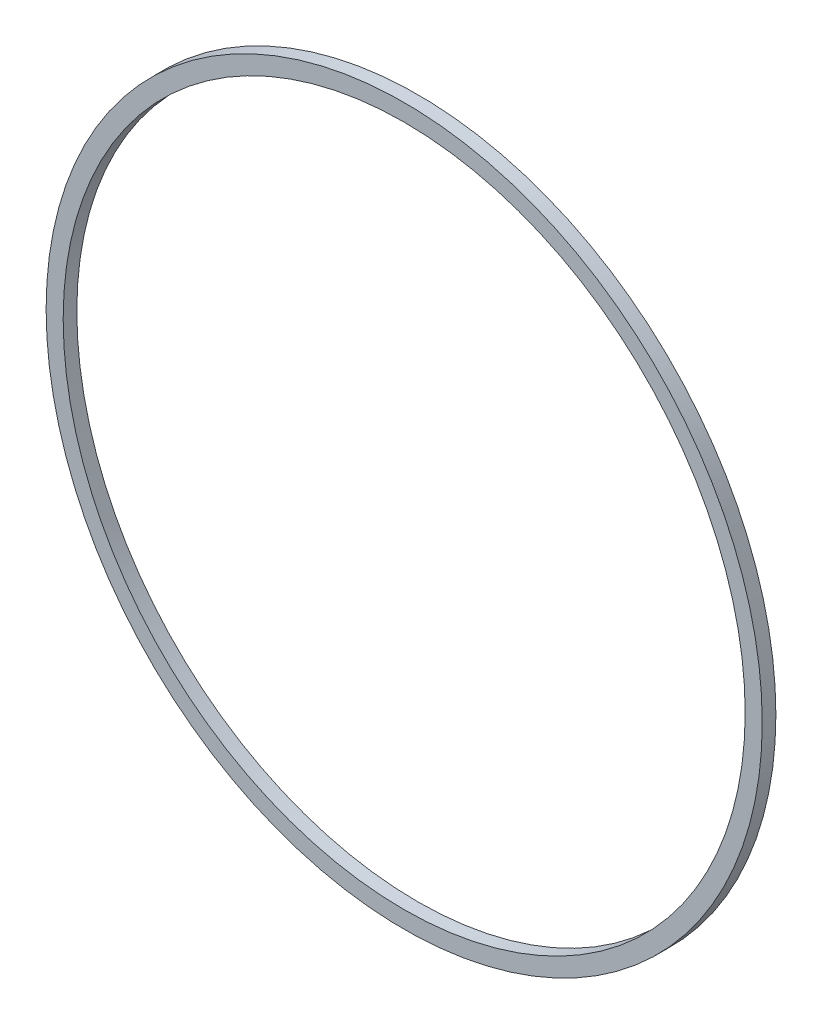
ISO-10303-21;
HEADER;
FILE_DESCRIPTION(('STEP AP214'),'2;1');
FILE_NAME('part.step','',(''),(''),'','','');
FILE_SCHEMA(('AUTOMOTIVE_DESIGN { 1 0 10303 214 1 1 1 1 }'));
ENDSEC;
DATA;
#1=APPLICATION_CONTEXT('core data for automotive mechanical design processes');
#2=APPLICATION_PROTOCOL_DEFINITION('international standard','automotive_design',2000,#1);
#3=PRODUCT_CONTEXT('',#1,'mechanical');
#4=PRODUCT('Part','Part','',(#3));
#5=PRODUCT_RELATED_PRODUCT_CATEGORY('part','',(#4));
#6=PRODUCT_DEFINITION_FORMATION('','',#4);
#7=PRODUCT_DEFINITION_CONTEXT('part definition',#1,'design');
#8=PRODUCT_DEFINITION('design','',#6,#7);
#9=PRODUCT_DEFINITION_SHAPE('','',#8);
#10=(LENGTH_UNIT() NAMED_UNIT(*) SI_UNIT(.MILLI.,.METRE.));
#11=(NAMED_UNIT(*) PLANE_ANGLE_UNIT() SI_UNIT($,.RADIAN.));
#12=(NAMED_UNIT(*) SI_UNIT($,.STERADIAN.) SOLID_ANGLE_UNIT());
#13=UNCERTAINTY_MEASURE_WITH_UNIT(LENGTH_MEASURE(1.E-05),#10,'distance_accuracy_value','');
#14=(GEOMETRIC_REPRESENTATION_CONTEXT(3) GLOBAL_UNCERTAINTY_ASSIGNED_CONTEXT((#13)) GLOBAL_UNIT_ASSIGNED_CONTEXT((#10,
#11,#12)) REPRESENTATION_CONTEXT('',''));
#15=CARTESIAN_POINT('',(0.,0.,0.));
#16=DIRECTION('',(0.,0.,1.));
#17=DIRECTION('',(1.,0.,0.));
#18=AXIS2_PLACEMENT_3D('',#15,#16,#17);
#19=CARTESIAN_POINT('',(0.,0.,2.));
#20=DIRECTION('',(0.,0.,1.));
#21=DIRECTION('',(1.,0.,0.));
#22=AXIS2_PLACEMENT_3D('',#19,#20,#21);
#23=PLANE('',#22);
#24=CARTESIAN_POINT('',(0.,0.,2.));
#25=DIRECTION('',(0.,0.,1.));
#26=DIRECTION('',(1.,0.,0.));
#27=AXIS2_PLACEMENT_3D('',#24,#25,#26);
#28=CIRCLE('',#27,52.5);
#29=CARTESIAN_POINT('',(52.5,0.,2.));
#30=VERTEX_POINT('',#29);
#31=EDGE_CURVE('E10',#30,#30,#28,.T.);
#32=ORIENTED_EDGE('',*,*,#31,.T.);
#33=EDGE_LOOP('',(#32));
#34=FACE_BOUND('',#33,.T.);
#35=CARTESIAN_POINT('',(0.,0.,2.));
#36=DIRECTION('',(0.,0.,1.));
#37=DIRECTION('',(1.,0.,0.));
#38=AXIS2_PLACEMENT_3D('',#35,#36,#37);
#39=CIRCLE('',#38,50.);
#40=CARTESIAN_POINT('',(50.,0.,2.));
#41=VERTEX_POINT('',#40);
#42=EDGE_CURVE('E45',#41,#41,#39,.T.);
#43=ORIENTED_EDGE('',*,*,#42,.F.);
#44=EDGE_LOOP('',(#43));
#45=FACE_BOUND('',#44,.T.);
#46=ADVANCED_FACE('F34',(#34,#45),#23,.T.);
#47=CARTESIAN_POINT('',(0.,0.,0.));
#48=DIRECTION('',(0.,0.,1.));
#49=DIRECTION('',(1.,0.,0.));
#50=AXIS2_PLACEMENT_3D('',#47,#48,#49);
#51=PLANE('',#50);
#52=CARTESIAN_POINT('',(0.,0.,0.));
#53=DIRECTION('',(0.,0.,1.));
#54=DIRECTION('',(1.,0.,0.));
#55=AXIS2_PLACEMENT_3D('',#52,#53,#54);
#56=CIRCLE('',#55,52.5);
#57=CARTESIAN_POINT('',(52.5,0.,0.));
#58=VERTEX_POINT('',#57);
#59=EDGE_CURVE('E38',#58,#58,#56,.T.);
#60=ORIENTED_EDGE('',*,*,#59,.F.);
#61=EDGE_LOOP('',(#60));
#62=FACE_BOUND('',#61,.T.);
#63=CARTESIAN_POINT('',(0.,0.,0.));
#64=DIRECTION('',(0.,0.,1.));
#65=DIRECTION('',(1.,0.,0.));
#66=AXIS2_PLACEMENT_3D('',#63,#64,#65);
#67=CIRCLE('',#66,50.);
#68=CARTESIAN_POINT('',(50.,0.,0.));
#69=VERTEX_POINT('',#68);
#70=EDGE_CURVE('E47',#69,#69,#67,.T.);
#71=ORIENTED_EDGE('',*,*,#70,.T.);
#72=EDGE_LOOP('',(#71));
#73=FACE_BOUND('',#72,.T.);
#74=ADVANCED_FACE('F57',(#62,#73),#51,.F.);
#75=CARTESIAN_POINT('',(0.,0.,2.));
#76=DIRECTION('',(0.,0.,-1.));
#77=DIRECTION('',(-1.,0.,0.));
#78=AXIS2_PLACEMENT_3D('',#75,#76,#77);
#79=CYLINDRICAL_SURFACE('',#78,52.5);
#80=ORIENTED_EDGE('',*,*,#31,.F.);
#81=EDGE_LOOP('',(#80));
#82=FACE_BOUND('',#81,.T.);
#83=ORIENTED_EDGE('',*,*,#59,.T.);
#84=EDGE_LOOP('',(#83));
#85=FACE_BOUND('',#84,.T.);
#86=ADVANCED_FACE('F36',(#82,#85),#79,.T.);
#87=CARTESIAN_POINT('',(0.,0.,2.));
#88=DIRECTION('',(0.,0.,-1.));
#89=DIRECTION('',(-1.,0.,0.));
#90=AXIS2_PLACEMENT_3D('',#87,#88,#89);
#91=CYLINDRICAL_SURFACE('',#90,50.);
#92=ORIENTED_EDGE('',*,*,#42,.T.);
#93=EDGE_LOOP('',(#92));
#94=FACE_BOUND('',#93,.T.);
#95=ORIENTED_EDGE('',*,*,#70,.F.);
#96=EDGE_LOOP('',(#95));
#97=FACE_BOUND('',#96,.T.);
#98=ADVANCED_FACE('F53',(#94,#97),#91,.F.);
#99=CLOSED_SHELL('',(#46,#74,#86,#98));
#100=MANIFOLD_SOLID_BREP('B2',#99);
#101=ADVANCED_BREP_SHAPE_REPRESENTATION('',(#18,#100),#14);
#102=SHAPE_DEFINITION_REPRESENTATION(#9,#101);
ENDSEC;
END-ISO-10303-21;
